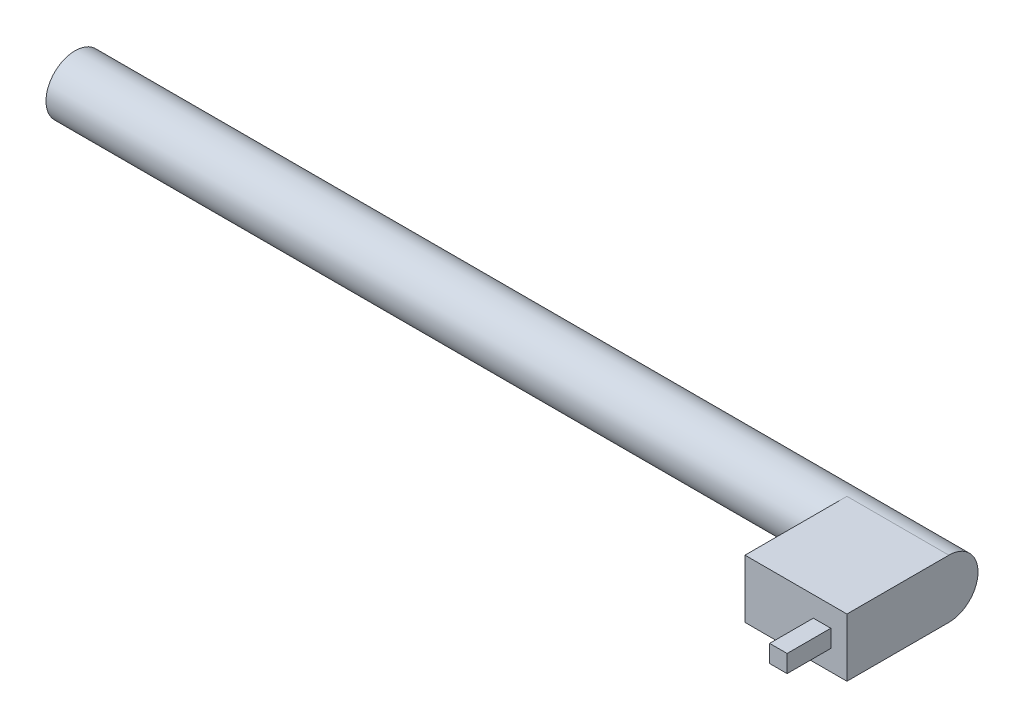
ISO-10303-21;
HEADER;
FILE_DESCRIPTION(('STEP AP214'),'2;1');
FILE_NAME('part.step','',(''),(''),'','','');
FILE_SCHEMA(('AUTOMOTIVE_DESIGN { 1 0 10303 214 1 1 1 1 }'));
ENDSEC;
DATA;
#1=APPLICATION_CONTEXT('core data for automotive mechanical design processes');
#2=APPLICATION_PROTOCOL_DEFINITION('international standard','automotive_design',2000,#1);
#3=PRODUCT_CONTEXT('',#1,'mechanical');
#4=PRODUCT('Part','Part','',(#3));
#5=PRODUCT_RELATED_PRODUCT_CATEGORY('part','',(#4));
#6=PRODUCT_DEFINITION_FORMATION('','',#4);
#7=PRODUCT_DEFINITION_CONTEXT('part definition',#1,'design');
#8=PRODUCT_DEFINITION('design','',#6,#7);
#9=PRODUCT_DEFINITION_SHAPE('','',#8);
#10=(LENGTH_UNIT() NAMED_UNIT(*) SI_UNIT(.MILLI.,.METRE.));
#11=(NAMED_UNIT(*) PLANE_ANGLE_UNIT() SI_UNIT($,.RADIAN.));
#12=(NAMED_UNIT(*) SI_UNIT($,.STERADIAN.) SOLID_ANGLE_UNIT());
#13=UNCERTAINTY_MEASURE_WITH_UNIT(LENGTH_MEASURE(1.E-05),#10,'distance_accuracy_value','');
#14=(GEOMETRIC_REPRESENTATION_CONTEXT(3) GLOBAL_UNCERTAINTY_ASSIGNED_CONTEXT((#13)) GLOBAL_UNIT_ASSIGNED_CONTEXT((#10,
#11,#12)) REPRESENTATION_CONTEXT('',''));
#15=CARTESIAN_POINT('',(0.,0.,0.));
#16=DIRECTION('',(0.,0.,1.));
#17=DIRECTION('',(1.,0.,0.));
#18=AXIS2_PLACEMENT_3D('',#15,#16,#17);
#19=CARTESIAN_POINT('',(0.,0.,35.));
#20=DIRECTION('',(0.,0.,1.));
#21=DIRECTION('',(1.,0.,0.));
#22=AXIS2_PLACEMENT_3D('',#19,#20,#21);
#23=PLANE('',#22);
#24=DIRECTION('',(0.,1.,0.));
#25=VECTOR('',#24,1.);
#26=CARTESIAN_POINT('',(150.,-10.,35.));
#27=LINE('',#26,#25);
#28=CARTESIAN_POINT('',(150.,-10.,35.));
#29=VERTEX_POINT('',#28);
#30=CARTESIAN_POINT('',(150.,10.,35.));
#31=VERTEX_POINT('',#30);
#32=EDGE_CURVE('E149',#29,#31,#27,.T.);
#33=ORIENTED_EDGE('',*,*,#32,.T.);
#34=DIRECTION('',(-1.,0.,0.));
#35=VECTOR('',#34,1.);
#36=CARTESIAN_POINT('',(150.,10.,35.));
#37=LINE('',#36,#35);
#38=CARTESIAN_POINT('',(115.,10.,35.));
#39=VERTEX_POINT('',#38);
#40=EDGE_CURVE('E153',#31,#39,#37,.T.);
#41=ORIENTED_EDGE('',*,*,#40,.T.);
#42=DIRECTION('',(0.,-1.,0.));
#43=VECTOR('',#42,1.);
#44=CARTESIAN_POINT('',(115.,-10.,35.));
#45=LINE('',#44,#43);
#46=CARTESIAN_POINT('',(115.,-10.,35.));
#47=VERTEX_POINT('',#46);
#48=EDGE_CURVE('E156',#39,#47,#45,.T.);
#49=ORIENTED_EDGE('',*,*,#48,.T.);
#50=DIRECTION('',(1.,0.,0.));
#51=VECTOR('',#50,1.);
#52=CARTESIAN_POINT('',(150.,-10.,35.));
#53=LINE('',#52,#51);
#54=EDGE_CURVE('E159',#47,#29,#53,.T.);
#55=ORIENTED_EDGE('',*,*,#54,.T.);
#56=EDGE_LOOP('',(#33,#41,#49,#55));
#57=FACE_BOUND('',#56,.T.);
#58=DIRECTION('',(0.,1.,0.));
#59=VECTOR('',#58,1.);
#60=CARTESIAN_POINT('',(144.458586474359,0.,35.));
#61=LINE('',#60,#59);
#62=CARTESIAN_POINT('',(144.458586474359,-3.,35.));
#63=VERTEX_POINT('',#62);
#64=CARTESIAN_POINT('',(144.458586474359,3.,35.));
#65=VERTEX_POINT('',#64);
#66=EDGE_CURVE('E63',#63,#65,#61,.T.);
#67=ORIENTED_EDGE('',*,*,#66,.F.);
#68=DIRECTION('',(1.,0.,0.));
#69=VECTOR('',#68,1.);
#70=CARTESIAN_POINT('',(0.,-3.,35.));
#71=LINE('',#70,#69);
#72=CARTESIAN_POINT('',(138.458586474359,-3.,35.));
#73=VERTEX_POINT('',#72);
#74=EDGE_CURVE('E136',#73,#63,#71,.T.);
#75=ORIENTED_EDGE('',*,*,#74,.F.);
#76=DIRECTION('',(0.,1.,0.));
#77=VECTOR('',#76,1.);
#78=CARTESIAN_POINT('',(138.458586474359,0.,35.));
#79=LINE('',#78,#77);
#80=CARTESIAN_POINT('',(138.458586474359,3.,35.));
#81=VERTEX_POINT('',#80);
#82=EDGE_CURVE('E133',#73,#81,#79,.T.);
#83=ORIENTED_EDGE('',*,*,#82,.T.);
#84=DIRECTION('',(1.,0.,0.));
#85=VECTOR('',#84,1.);
#86=CARTESIAN_POINT('',(0.,3.,35.));
#87=LINE('',#86,#85);
#88=EDGE_CURVE('E68',#81,#65,#87,.T.);
#89=ORIENTED_EDGE('',*,*,#88,.T.);
#90=EDGE_LOOP('',(#67,#75,#83,#89));
#91=FACE_BOUND('',#90,.T.);
#92=ADVANCED_FACE('F47',(#57,#91),#23,.T.);
#93=CARTESIAN_POINT('',(150.,0.,0.));
#94=DIRECTION('',(-1.,0.,0.));
#95=DIRECTION('',(0.,0.,1.));
#96=AXIS2_PLACEMENT_3D('',#93,#94,#95);
#97=CYLINDRICAL_SURFACE('',#96,10.);
#98=CARTESIAN_POINT('',(-150.,0.,0.));
#99=DIRECTION('',(1.,0.,0.));
#100=DIRECTION('',(0.,0.,-1.));
#101=AXIS2_PLACEMENT_3D('',#98,#99,#100);
#102=CIRCLE('',#101,10.);
#103=CARTESIAN_POINT('',(-150.,0.,-10.));
#104=VERTEX_POINT('',#103);
#105=EDGE_CURVE('E181',#104,#104,#102,.T.);
#106=ORIENTED_EDGE('',*,*,#105,.T.);
#107=EDGE_LOOP('',(#106));
#108=FACE_BOUND('',#107,.T.);
#109=DIRECTION('',(-1.,0.,0.));
#110=VECTOR('',#109,1.);
#111=CARTESIAN_POINT('',(150.,10.,0.));
#112=LINE('',#111,#110);
#113=CARTESIAN_POINT('',(150.,10.,0.));
#114=VERTEX_POINT('',#113);
#115=CARTESIAN_POINT('',(115.,10.,0.));
#116=VERTEX_POINT('',#115);
#117=EDGE_CURVE('E138',#114,#116,#112,.T.);
#118=ORIENTED_EDGE('',*,*,#117,.F.);
#119=CARTESIAN_POINT('',(150.,0.,0.));
#120=DIRECTION('',(1.,0.,0.));
#121=DIRECTION('',(0.,0.,-1.));
#122=AXIS2_PLACEMENT_3D('',#119,#120,#121);
#123=CIRCLE('',#122,10.);
#124=CARTESIAN_POINT('',(150.,-10.,0.));
#125=VERTEX_POINT('',#124);
#126=EDGE_CURVE('E56',#125,#114,#123,.T.);
#127=ORIENTED_EDGE('',*,*,#126,.F.);
#128=DIRECTION('',(1.,0.,0.));
#129=VECTOR('',#128,1.);
#130=CARTESIAN_POINT('',(150.,-10.,0.));
#131=LINE('',#130,#129);
#132=CARTESIAN_POINT('',(115.,-10.,0.));
#133=VERTEX_POINT('',#132);
#134=EDGE_CURVE('E143',#133,#125,#131,.T.);
#135=ORIENTED_EDGE('',*,*,#134,.F.);
#136=CARTESIAN_POINT('',(115.,0.,0.));
#137=DIRECTION('',(1.,0.,0.));
#138=DIRECTION('',(0.,0.,-1.));
#139=AXIS2_PLACEMENT_3D('',#136,#137,#138);
#140=CIRCLE('',#139,10.);
#141=EDGE_CURVE('E11',#116,#133,#140,.T.);
#142=ORIENTED_EDGE('',*,*,#141,.F.);
#143=EDGE_LOOP('',(#118,#127,#135,#142));
#144=FACE_BOUND('',#143,.T.);
#145=ADVANCED_FACE('F49',(#108,#144),#97,.T.);
#146=CARTESIAN_POINT('',(150.,0.,0.));
#147=DIRECTION('',(1.,0.,0.));
#148=DIRECTION('',(0.,0.,-1.));
#149=AXIS2_PLACEMENT_3D('',#146,#147,#148);
#150=PLANE('',#149);
#151=ORIENTED_EDGE('',*,*,#126,.T.);
#152=DIRECTION('',(0.,0.,-1.));
#153=VECTOR('',#152,1.);
#154=CARTESIAN_POINT('',(150.,10.,35.));
#155=LINE('',#154,#153);
#156=EDGE_CURVE('E177',#31,#114,#155,.T.);
#157=ORIENTED_EDGE('',*,*,#156,.F.);
#158=ORIENTED_EDGE('',*,*,#32,.F.);
#159=DIRECTION('',(0.,0.,-1.));
#160=VECTOR('',#159,1.);
#161=CARTESIAN_POINT('',(150.,-10.,35.));
#162=LINE('',#161,#160);
#163=EDGE_CURVE('E161',#29,#125,#162,.T.);
#164=ORIENTED_EDGE('',*,*,#163,.T.);
#165=EDGE_LOOP('',(#151,#157,#158,#164));
#166=FACE_BOUND('',#165,.T.);
#167=ADVANCED_FACE('F193',(#166),#150,.T.);
#168=CARTESIAN_POINT('',(-150.,0.,0.));
#169=DIRECTION('',(1.,0.,0.));
#170=DIRECTION('',(0.,0.,-1.));
#171=AXIS2_PLACEMENT_3D('',#168,#169,#170);
#172=PLANE('',#171);
#173=ORIENTED_EDGE('',*,*,#105,.F.);
#174=EDGE_LOOP('',(#173));
#175=FACE_BOUND('',#174,.T.);
#176=ADVANCED_FACE('F190',(#175),#172,.F.);
#177=CARTESIAN_POINT('',(150.,10.,35.));
#178=DIRECTION('',(0.,-1.,0.));
#179=DIRECTION('',(0.,0.,-1.));
#180=AXIS2_PLACEMENT_3D('',#177,#178,#179);
#181=PLANE('',#180);
#182=ORIENTED_EDGE('',*,*,#117,.T.);
#183=DIRECTION('',(0.,0.,-1.));
#184=VECTOR('',#183,1.);
#185=CARTESIAN_POINT('',(115.,10.,35.));
#186=LINE('',#185,#184);
#187=EDGE_CURVE('E173',#39,#116,#186,.T.);
#188=ORIENTED_EDGE('',*,*,#187,.F.);
#189=ORIENTED_EDGE('',*,*,#40,.F.);
#190=ORIENTED_EDGE('',*,*,#156,.T.);
#191=EDGE_LOOP('',(#182,#188,#189,#190));
#192=FACE_BOUND('',#191,.T.);
#193=ADVANCED_FACE('F192',(#192),#181,.F.);
#194=CARTESIAN_POINT('',(115.,-10.,35.));
#195=DIRECTION('',(1.,0.,0.));
#196=DIRECTION('',(0.,0.,-1.));
#197=AXIS2_PLACEMENT_3D('',#194,#195,#196);
#198=PLANE('',#197);
#199=ORIENTED_EDGE('',*,*,#187,.T.);
#200=ORIENTED_EDGE('',*,*,#141,.T.);
#201=DIRECTION('',(0.,0.,-1.));
#202=VECTOR('',#201,1.);
#203=CARTESIAN_POINT('',(115.,-10.,35.));
#204=LINE('',#203,#202);
#205=EDGE_CURVE('E169',#47,#133,#204,.T.);
#206=ORIENTED_EDGE('',*,*,#205,.F.);
#207=ORIENTED_EDGE('',*,*,#48,.F.);
#208=EDGE_LOOP('',(#199,#200,#206,#207));
#209=FACE_BOUND('',#208,.T.);
#210=ADVANCED_FACE('F198',(#209),#198,.F.);
#211=CARTESIAN_POINT('',(150.,-10.,35.));
#212=DIRECTION('',(0.,1.,0.));
#213=DIRECTION('',(-1.,0.,0.));
#214=AXIS2_PLACEMENT_3D('',#211,#212,#213);
#215=PLANE('',#214);
#216=ORIENTED_EDGE('',*,*,#134,.T.);
#217=ORIENTED_EDGE('',*,*,#163,.F.);
#218=ORIENTED_EDGE('',*,*,#54,.F.);
#219=ORIENTED_EDGE('',*,*,#205,.T.);
#220=EDGE_LOOP('',(#216,#217,#218,#219));
#221=FACE_BOUND('',#220,.T.);
#222=ADVANCED_FACE('F214',(#221),#215,.F.);
#223=CARTESIAN_POINT('',(0.,-3.,50.));
#224=DIRECTION('',(0.,1.,0.));
#225=DIRECTION('',(0.,0.,1.));
#226=AXIS2_PLACEMENT_3D('',#223,#224,#225);
#227=PLANE('',#226);
#228=ORIENTED_EDGE('',*,*,#74,.T.);
#229=DIRECTION('',(0.,0.,-1.));
#230=VECTOR('',#229,1.);
#231=CARTESIAN_POINT('',(144.458586474359,-3.,50.));
#232=LINE('',#231,#230);
#233=CARTESIAN_POINT('',(144.458586474359,-3.,50.));
#234=VERTEX_POINT('',#233);
#235=EDGE_CURVE('E115',#234,#63,#232,.T.);
#236=ORIENTED_EDGE('',*,*,#235,.F.);
#237=DIRECTION('',(1.,0.,0.));
#238=VECTOR('',#237,1.);
#239=CARTESIAN_POINT('',(0.,-3.,50.));
#240=LINE('',#239,#238);
#241=CARTESIAN_POINT('',(138.458586474359,-3.,50.));
#242=VERTEX_POINT('',#241);
#243=EDGE_CURVE('E123',#242,#234,#240,.T.);
#244=ORIENTED_EDGE('',*,*,#243,.F.);
#245=DIRECTION('',(0.,0.,-1.));
#246=VECTOR('',#245,1.);
#247=CARTESIAN_POINT('',(138.458586474359,-3.,50.));
#248=LINE('',#247,#246);
#249=EDGE_CURVE('E286',#242,#73,#248,.T.);
#250=ORIENTED_EDGE('',*,*,#249,.T.);
#251=EDGE_LOOP('',(#228,#236,#244,#250));
#252=FACE_BOUND('',#251,.T.);
#253=ADVANCED_FACE('F135',(#252),#227,.F.);
#254=CARTESIAN_POINT('',(144.458586474359,0.,50.));
#255=DIRECTION('',(-1.,0.,0.));
#256=DIRECTION('',(0.,0.,1.));
#257=AXIS2_PLACEMENT_3D('',#254,#255,#256);
#258=PLANE('',#257);
#259=ORIENTED_EDGE('',*,*,#66,.T.);
#260=DIRECTION('',(0.,0.,-1.));
#261=VECTOR('',#260,1.);
#262=CARTESIAN_POINT('',(144.458586474359,3.,50.));
#263=LINE('',#262,#261);
#264=CARTESIAN_POINT('',(144.458586474359,3.,50.));
#265=VERTEX_POINT('',#264);
#266=EDGE_CURVE('E117',#265,#65,#263,.T.);
#267=ORIENTED_EDGE('',*,*,#266,.F.);
#268=DIRECTION('',(0.,1.,0.));
#269=VECTOR('',#268,1.);
#270=CARTESIAN_POINT('',(144.458586474359,0.,50.));
#271=LINE('',#270,#269);
#272=EDGE_CURVE('E111',#234,#265,#271,.T.);
#273=ORIENTED_EDGE('',*,*,#272,.F.);
#274=ORIENTED_EDGE('',*,*,#235,.T.);
#275=EDGE_LOOP('',(#259,#267,#273,#274));
#276=FACE_BOUND('',#275,.T.);
#277=ADVANCED_FACE('F113',(#276),#258,.F.);
#278=CARTESIAN_POINT('',(0.,3.,50.));
#279=DIRECTION('',(0.,1.,0.));
#280=DIRECTION('',(0.,0.,1.));
#281=AXIS2_PLACEMENT_3D('',#278,#279,#280);
#282=PLANE('',#281);
#283=ORIENTED_EDGE('',*,*,#88,.F.);
#284=DIRECTION('',(0.,0.,-1.));
#285=VECTOR('',#284,1.);
#286=CARTESIAN_POINT('',(138.458586474359,3.,50.));
#287=LINE('',#286,#285);
#288=CARTESIAN_POINT('',(138.458586474359,3.,50.));
#289=VERTEX_POINT('',#288);
#290=EDGE_CURVE('E145',#289,#81,#287,.T.);
#291=ORIENTED_EDGE('',*,*,#290,.F.);
#292=DIRECTION('',(1.,0.,0.));
#293=VECTOR('',#292,1.);
#294=CARTESIAN_POINT('',(0.,3.,50.));
#295=LINE('',#294,#293);
#296=EDGE_CURVE('E122',#289,#265,#295,.T.);
#297=ORIENTED_EDGE('',*,*,#296,.T.);
#298=ORIENTED_EDGE('',*,*,#266,.T.);
#299=EDGE_LOOP('',(#283,#291,#297,#298));
#300=FACE_BOUND('',#299,.T.);
#301=ADVANCED_FACE('F255',(#300),#282,.T.);
#302=CARTESIAN_POINT('',(138.458586474359,0.,50.));
#303=DIRECTION('',(-1.,0.,0.));
#304=DIRECTION('',(0.,0.,1.));
#305=AXIS2_PLACEMENT_3D('',#302,#303,#304);
#306=PLANE('',#305);
#307=ORIENTED_EDGE('',*,*,#82,.F.);
#308=ORIENTED_EDGE('',*,*,#249,.F.);
#309=DIRECTION('',(0.,1.,0.));
#310=VECTOR('',#309,1.);
#311=CARTESIAN_POINT('',(138.458586474359,0.,50.));
#312=LINE('',#311,#310);
#313=EDGE_CURVE('E129',#242,#289,#312,.T.);
#314=ORIENTED_EDGE('',*,*,#313,.T.);
#315=ORIENTED_EDGE('',*,*,#290,.T.);
#316=EDGE_LOOP('',(#307,#308,#314,#315));
#317=FACE_BOUND('',#316,.T.);
#318=ADVANCED_FACE('F263',(#317),#306,.T.);
#319=CARTESIAN_POINT('',(0.,0.,50.));
#320=DIRECTION('',(0.,0.,1.));
#321=DIRECTION('',(1.,0.,0.));
#322=AXIS2_PLACEMENT_3D('',#319,#320,#321);
#323=PLANE('',#322);
#324=ORIENTED_EDGE('',*,*,#243,.T.);
#325=ORIENTED_EDGE('',*,*,#272,.T.);
#326=ORIENTED_EDGE('',*,*,#296,.F.);
#327=ORIENTED_EDGE('',*,*,#313,.F.);
#328=EDGE_LOOP('',(#324,#325,#326,#327));
#329=FACE_BOUND('',#328,.T.);
#330=ADVANCED_FACE('F127',(#329),#323,.T.);
#331=CLOSED_SHELL('',(#92,#145,#167,#176,#193,#210,#222,#253,#277,#301,#318,#330));
#332=MANIFOLD_SOLID_BREP('B2',#331);
#333=ADVANCED_BREP_SHAPE_REPRESENTATION('',(#18,#332),#14);
#334=SHAPE_DEFINITION_REPRESENTATION(#9,#333);
ENDSEC;
END-ISO-10303-21;
